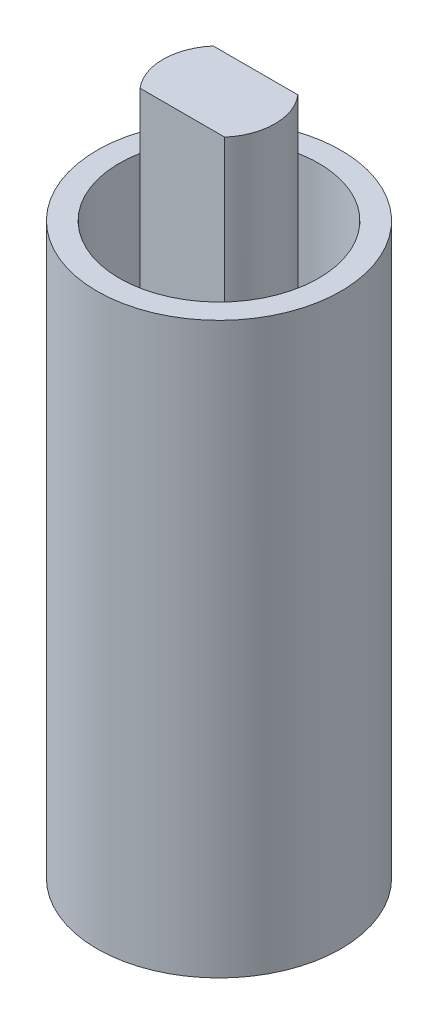
ISO-10303-21;
HEADER;
FILE_DESCRIPTION(('STEP AP214'),'2;1');
FILE_NAME('part.step','',(''),(''),'','','');
FILE_SCHEMA(('AUTOMOTIVE_DESIGN { 1 0 10303 214 1 1 1 1 }'));
ENDSEC;
DATA;
#1=APPLICATION_CONTEXT('core data for automotive mechanical design processes');
#2=APPLICATION_PROTOCOL_DEFINITION('international standard','automotive_design',2000,#1);
#3=PRODUCT_CONTEXT('',#1,'mechanical');
#4=PRODUCT('Part','Part','',(#3));
#5=PRODUCT_RELATED_PRODUCT_CATEGORY('part','',(#4));
#6=PRODUCT_DEFINITION_FORMATION('','',#4);
#7=PRODUCT_DEFINITION_CONTEXT('part definition',#1,'design');
#8=PRODUCT_DEFINITION('design','',#6,#7);
#9=PRODUCT_DEFINITION_SHAPE('','',#8);
#10=(LENGTH_UNIT() NAMED_UNIT(*) SI_UNIT(.MILLI.,.METRE.));
#11=(NAMED_UNIT(*) PLANE_ANGLE_UNIT() SI_UNIT($,.RADIAN.));
#12=(NAMED_UNIT(*) SI_UNIT($,.STERADIAN.) SOLID_ANGLE_UNIT());
#13=UNCERTAINTY_MEASURE_WITH_UNIT(LENGTH_MEASURE(1.E-05),#10,'distance_accuracy_value','');
#14=(GEOMETRIC_REPRESENTATION_CONTEXT(3) GLOBAL_UNCERTAINTY_ASSIGNED_CONTEXT((#13)) GLOBAL_UNIT_ASSIGNED_CONTEXT((#10,
#11,#12)) REPRESENTATION_CONTEXT('',''));
#15=CARTESIAN_POINT('',(0.,0.,0.));
#16=DIRECTION('',(0.,0.,1.));
#17=DIRECTION('',(1.,0.,0.));
#18=AXIS2_PLACEMENT_3D('',#15,#16,#17);
#19=CARTESIAN_POINT('',(0.,0.,0.));
#20=DIRECTION('',(0.,-1.,0.));
#21=DIRECTION('',(0.,0.,-1.));
#22=AXIS2_PLACEMENT_3D('',#19,#20,#21);
#23=PLANE('',#22);
#24=CARTESIAN_POINT('',(0.,0.,0.));
#25=DIRECTION('',(0.,1.,0.));
#26=DIRECTION('',(0.,0.,1.));
#27=AXIS2_PLACEMENT_3D('',#24,#25,#26);
#28=CIRCLE('',#27,2.75);
#29=CARTESIAN_POINT('',(0.,0.,2.75));
#30=VERTEX_POINT('',#29);
#31=EDGE_CURVE('E43',#30,#30,#28,.T.);
#32=ORIENTED_EDGE('',*,*,#31,.F.);
#33=EDGE_LOOP('',(#32));
#34=FACE_BOUND('',#33,.T.);
#35=CARTESIAN_POINT('',(0.,0.,0.));
#36=DIRECTION('',(0.,1.,0.));
#37=DIRECTION('',(0.,0.,1.));
#38=AXIS2_PLACEMENT_3D('',#35,#36,#37);
#39=CIRCLE('',#38,4.9);
#40=CARTESIAN_POINT('',(0.,0.,4.9));
#41=VERTEX_POINT('',#40);
#42=EDGE_CURVE('E134',#41,#41,#39,.T.);
#43=ORIENTED_EDGE('',*,*,#42,.T.);
#44=EDGE_LOOP('',(#43));
#45=FACE_BOUND('',#44,.T.);
#46=ADVANCED_FACE('F39',(#34,#45),#23,.F.);
#47=CARTESIAN_POINT('',(0.,1.8,0.));
#48=DIRECTION('',(0.,1.,0.));
#49=DIRECTION('',(0.,0.,1.));
#50=AXIS2_PLACEMENT_3D('',#47,#48,#49);
#51=PLANE('',#50);
#52=DIRECTION('',(-1.,0.,0.));
#53=VECTOR('',#52,1.);
#54=CARTESIAN_POINT('',(-2.0790623,1.8,-1.79999998686631));
#55=LINE('',#54,#53);
#56=CARTESIAN_POINT('',(2.0790623,1.8,-1.79999998686631));
#57=VERTEX_POINT('',#56);
#58=CARTESIAN_POINT('',(-2.0790623,1.8,-1.79999998686631));
#59=VERTEX_POINT('',#58);
#60=EDGE_CURVE('E101',#57,#59,#55,.T.);
#61=ORIENTED_EDGE('',*,*,#60,.F.);
#62=CARTESIAN_POINT('',(0.,1.8,0.));
#63=DIRECTION('',(0.,1.,0.));
#64=DIRECTION('',(0.,0.,1.));
#65=AXIS2_PLACEMENT_3D('',#62,#63,#64);
#66=CIRCLE('',#65,2.75);
#67=EDGE_CURVE('E11',#57,#59,#66,.T.);
#68=ORIENTED_EDGE('',*,*,#67,.T.);
#69=EDGE_LOOP('',(#61,#68));
#70=FACE_BOUND('',#69,.T.);
#71=ADVANCED_FACE('F159',(#70),#51,.T.);
#72=CARTESIAN_POINT('',(0.,1.8,0.));
#73=DIRECTION('',(0.,-1.,0.));
#74=DIRECTION('',(0.,0.,-1.));
#75=AXIS2_PLACEMENT_3D('',#72,#73,#74);
#76=CYLINDRICAL_SURFACE('',#75,2.75);
#77=ORIENTED_EDGE('',*,*,#67,.F.);
#78=DIRECTION('',(0.,-1.,0.));
#79=VECTOR('',#78,1.);
#80=CARTESIAN_POINT('',(2.0790623,23.5,-1.79999998686631));
#81=LINE('',#80,#79);
#82=CARTESIAN_POINT('',(2.0790623,23.5,-1.79999998686631));
#83=VERTEX_POINT('',#82);
#84=EDGE_CURVE('E108',#83,#57,#81,.T.);
#85=ORIENTED_EDGE('',*,*,#84,.F.);
#86=CARTESIAN_POINT('',(0.,23.5,0.));
#87=DIRECTION('',(0.,1.,0.));
#88=DIRECTION('',(0.,0.,1.));
#89=AXIS2_PLACEMENT_3D('',#86,#87,#88);
#90=CIRCLE('',#89,2.75);
#91=CARTESIAN_POINT('',(2.0790623,23.5,1.79999998686631));
#92=VERTEX_POINT('',#91);
#93=EDGE_CURVE('E90',#92,#83,#90,.T.);
#94=ORIENTED_EDGE('',*,*,#93,.F.);
#95=DIRECTION('',(0.,-1.,0.));
#96=VECTOR('',#95,1.);
#97=CARTESIAN_POINT('',(2.0790623,23.5,1.79999998686631));
#98=LINE('',#97,#96);
#99=CARTESIAN_POINT('',(2.0790623,1.8,1.79999998686631));
#100=VERTEX_POINT('',#99);
#101=EDGE_CURVE('E86',#92,#100,#98,.T.);
#102=ORIENTED_EDGE('',*,*,#101,.T.);
#103=CARTESIAN_POINT('',(-2.0790623,1.8,1.79999998686631));
#104=VERTEX_POINT('',#103);
#105=EDGE_CURVE('E49',#104,#100,#66,.T.);
#106=ORIENTED_EDGE('',*,*,#105,.F.);
#107=DIRECTION('',(0.,-1.,0.));
#108=VECTOR('',#107,1.);
#109=CARTESIAN_POINT('',(-2.0790623,23.5,1.79999998686631));
#110=LINE('',#109,#108);
#111=CARTESIAN_POINT('',(-2.0790623,23.5,1.79999998686631));
#112=VERTEX_POINT('',#111);
#113=EDGE_CURVE('E84',#112,#104,#110,.T.);
#114=ORIENTED_EDGE('',*,*,#113,.F.);
#115=CARTESIAN_POINT('',(0.,23.5,0.));
#116=DIRECTION('',(0.,1.,0.));
#117=DIRECTION('',(0.,0.,1.));
#118=AXIS2_PLACEMENT_3D('',#115,#116,#117);
#119=CIRCLE('',#118,2.75);
#120=CARTESIAN_POINT('',(-2.0790623,23.5,-1.79999998686631));
#121=VERTEX_POINT('',#120);
#122=EDGE_CURVE('E91',#121,#112,#119,.T.);
#123=ORIENTED_EDGE('',*,*,#122,.F.);
#124=DIRECTION('',(0.,-1.,0.));
#125=VECTOR('',#124,1.);
#126=CARTESIAN_POINT('',(-2.0790623,23.5,-1.79999998686631));
#127=LINE('',#126,#125);
#128=EDGE_CURVE('E114',#121,#59,#127,.T.);
#129=ORIENTED_EDGE('',*,*,#128,.T.);
#130=EDGE_LOOP('',(#77,#85,#94,#102,#106,#114,#123,#129));
#131=FACE_BOUND('',#130,.T.);
#132=ORIENTED_EDGE('',*,*,#31,.T.);
#133=EDGE_LOOP('',(#132));
#134=FACE_BOUND('',#133,.T.);
#135=ADVANCED_FACE('F41',(#131,#134),#76,.T.);
#136=DIRECTION('',(1.,0.,0.));
#137=VECTOR('',#136,1.);
#138=CARTESIAN_POINT('',(-2.0790623,1.8,1.79999998686631));
#139=LINE('',#138,#137);
#140=EDGE_CURVE('E55',#104,#100,#139,.T.);
#141=ORIENTED_EDGE('',*,*,#140,.F.);
#142=ORIENTED_EDGE('',*,*,#105,.T.);
#143=EDGE_LOOP('',(#141,#142));
#144=FACE_BOUND('',#143,.T.);
#145=ADVANCED_FACE('F165',(#144),#51,.T.);
#146=CARTESIAN_POINT('',(-2.0790623,23.5,1.79999998686631));
#147=DIRECTION('',(0.,0.,-1.));
#148=DIRECTION('',(-1.,0.,0.));
#149=AXIS2_PLACEMENT_3D('',#146,#147,#148);
#150=PLANE('',#149);
#151=ORIENTED_EDGE('',*,*,#140,.T.);
#152=ORIENTED_EDGE('',*,*,#101,.F.);
#153=DIRECTION('',(1.,0.,0.));
#154=VECTOR('',#153,1.);
#155=CARTESIAN_POINT('',(-2.0790623,23.5,1.79999998686631));
#156=LINE('',#155,#154);
#157=EDGE_CURVE('E80',#112,#92,#156,.T.);
#158=ORIENTED_EDGE('',*,*,#157,.F.);
#159=ORIENTED_EDGE('',*,*,#113,.T.);
#160=EDGE_LOOP('',(#151,#152,#158,#159));
#161=FACE_BOUND('',#160,.T.);
#162=ADVANCED_FACE('F82',(#161),#150,.F.);
#163=CARTESIAN_POINT('',(-2.0790623,23.5,-1.79999998686631));
#164=DIRECTION('',(0.,0.,1.));
#165=DIRECTION('',(1.,0.,0.));
#166=AXIS2_PLACEMENT_3D('',#163,#164,#165);
#167=PLANE('',#166);
#168=ORIENTED_EDGE('',*,*,#60,.T.);
#169=ORIENTED_EDGE('',*,*,#128,.F.);
#170=DIRECTION('',(-1.,0.,0.));
#171=VECTOR('',#170,1.);
#172=CARTESIAN_POINT('',(-2.0790623,23.5,-1.79999998686631));
#173=LINE('',#172,#171);
#174=EDGE_CURVE('E96',#83,#121,#173,.T.);
#175=ORIENTED_EDGE('',*,*,#174,.F.);
#176=ORIENTED_EDGE('',*,*,#84,.T.);
#177=EDGE_LOOP('',(#168,#169,#175,#176));
#178=FACE_BOUND('',#177,.T.);
#179=ADVANCED_FACE('F156',(#178),#167,.F.);
#180=CARTESIAN_POINT('',(0.,23.5,0.));
#181=DIRECTION('',(0.,1.,0.));
#182=DIRECTION('',(0.,0.,1.));
#183=AXIS2_PLACEMENT_3D('',#180,#181,#182);
#184=PLANE('',#183);
#185=ORIENTED_EDGE('',*,*,#122,.T.);
#186=ORIENTED_EDGE('',*,*,#157,.T.);
#187=ORIENTED_EDGE('',*,*,#93,.T.);
#188=ORIENTED_EDGE('',*,*,#174,.T.);
#189=EDGE_LOOP('',(#185,#186,#187,#188));
#190=FACE_BOUND('',#189,.T.);
#191=ADVANCED_FACE('F94',(#190),#184,.T.);
#192=CARTESIAN_POINT('',(0.,18.,0.));
#193=DIRECTION('',(0.,1.,0.));
#194=DIRECTION('',(0.,0.,1.));
#195=AXIS2_PLACEMENT_3D('',#192,#193,#194);
#196=PLANE('',#195);
#197=CARTESIAN_POINT('',(0.,18.,0.));
#198=DIRECTION('',(0.,1.,0.));
#199=DIRECTION('',(0.,0.,1.));
#200=AXIS2_PLACEMENT_3D('',#197,#198,#199);
#201=CIRCLE('',#200,6.);
#202=CARTESIAN_POINT('',(0.,18.,6.));
#203=VERTEX_POINT('',#202);
#204=EDGE_CURVE('E129',#203,#203,#201,.T.);
#205=ORIENTED_EDGE('',*,*,#204,.T.);
#206=EDGE_LOOP('',(#205));
#207=FACE_BOUND('',#206,.T.);
#208=CARTESIAN_POINT('',(0.,18.,0.));
#209=DIRECTION('',(0.,1.,0.));
#210=DIRECTION('',(0.,0.,1.));
#211=AXIS2_PLACEMENT_3D('',#208,#209,#210);
#212=CIRCLE('',#211,4.9);
#213=CARTESIAN_POINT('',(0.,18.,4.9));
#214=VERTEX_POINT('',#213);
#215=EDGE_CURVE('E133',#214,#214,#212,.T.);
#216=ORIENTED_EDGE('',*,*,#215,.F.);
#217=EDGE_LOOP('',(#216));
#218=FACE_BOUND('',#217,.T.);
#219=ADVANCED_FACE('F145',(#207,#218),#196,.T.);
#220=CARTESIAN_POINT('',(0.,18.,0.));
#221=DIRECTION('',(0.,-1.,0.));
#222=DIRECTION('',(0.,0.,-1.));
#223=AXIS2_PLACEMENT_3D('',#220,#221,#222);
#224=CYLINDRICAL_SURFACE('',#223,4.9);
#225=ORIENTED_EDGE('',*,*,#215,.T.);
#226=EDGE_LOOP('',(#225));
#227=FACE_BOUND('',#226,.T.);
#228=ORIENTED_EDGE('',*,*,#42,.F.);
#229=EDGE_LOOP('',(#228));
#230=FACE_BOUND('',#229,.T.);
#231=ADVANCED_FACE('F142',(#227,#230),#224,.F.);
#232=CARTESIAN_POINT('',(0.,-10.,0.));
#233=DIRECTION('',(0.,-1.,0.));
#234=DIRECTION('',(0.,0.,-1.));
#235=AXIS2_PLACEMENT_3D('',#232,#233,#234);
#236=PLANE('',#235);
#237=CARTESIAN_POINT('',(0.,-10.,0.));
#238=DIRECTION('',(0.,-1.,0.));
#239=DIRECTION('',(0.,0.,-1.));
#240=AXIS2_PLACEMENT_3D('',#237,#238,#239);
#241=CIRCLE('',#240,6.);
#242=CARTESIAN_POINT('',(0.,-10.,-6.));
#243=VERTEX_POINT('',#242);
#244=EDGE_CURVE('E125',#243,#243,#241,.T.);
#245=ORIENTED_EDGE('',*,*,#244,.T.);
#246=EDGE_LOOP('',(#245));
#247=FACE_BOUND('',#246,.T.);
#248=ADVANCED_FACE('F153',(#247),#236,.T.);
#249=CARTESIAN_POINT('',(0.,-10.,0.));
#250=DIRECTION('',(0.,1.,0.));
#251=DIRECTION('',(0.,0.,1.));
#252=AXIS2_PLACEMENT_3D('',#249,#250,#251);
#253=CYLINDRICAL_SURFACE('',#252,6.);
#254=ORIENTED_EDGE('',*,*,#244,.F.);
#255=EDGE_LOOP('',(#254));
#256=FACE_BOUND('',#255,.T.);
#257=ORIENTED_EDGE('',*,*,#204,.F.);
#258=EDGE_LOOP('',(#257));
#259=FACE_BOUND('',#258,.T.);
#260=ADVANCED_FACE('F169',(#256,#259),#253,.T.);
#261=CLOSED_SHELL('',(#46,#71,#135,#145,#162,#179,#191,#219,#231,#248,#260));
#262=MANIFOLD_SOLID_BREP('B2',#261);
#263=ADVANCED_BREP_SHAPE_REPRESENTATION('',(#18,#262),#14);
#264=SHAPE_DEFINITION_REPRESENTATION(#9,#263);
ENDSEC;
END-ISO-10303-21;
